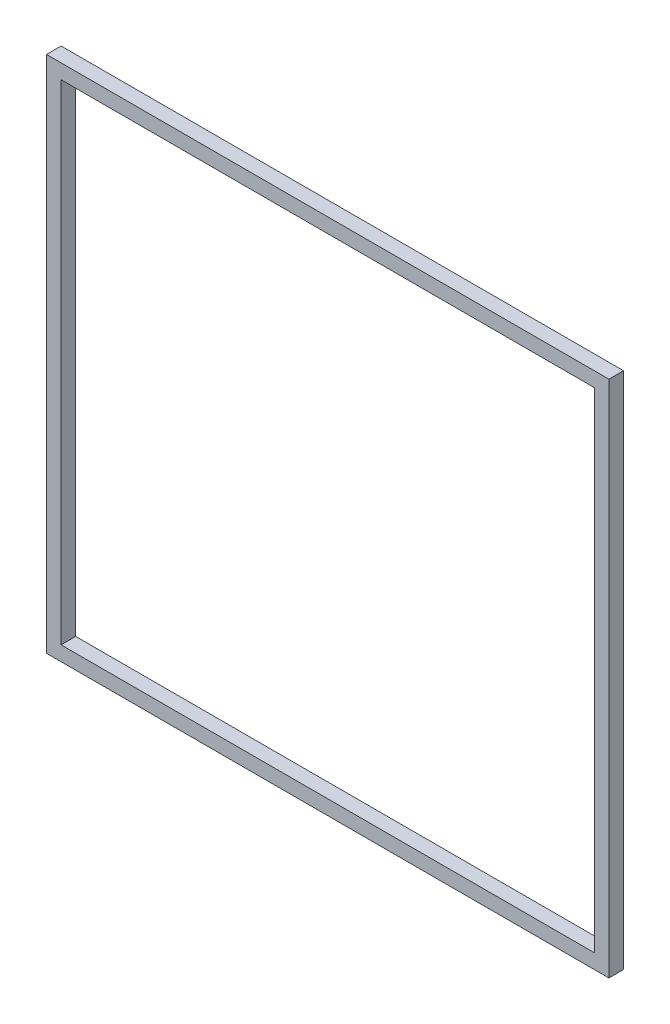
ISO-10303-21;
HEADER;
FILE_DESCRIPTION(('STEP AP214'),'2;1');
FILE_NAME('part.step','',(''),(''),'','','');
FILE_SCHEMA(('AUTOMOTIVE_DESIGN { 1 0 10303 214 1 1 1 1 }'));
ENDSEC;
DATA;
#1=APPLICATION_CONTEXT('core data for automotive mechanical design processes');
#2=APPLICATION_PROTOCOL_DEFINITION('international standard','automotive_design',2000,#1);
#3=PRODUCT_CONTEXT('',#1,'mechanical');
#4=PRODUCT('Part','Part','',(#3));
#5=PRODUCT_RELATED_PRODUCT_CATEGORY('part','',(#4));
#6=PRODUCT_DEFINITION_FORMATION('','',#4);
#7=PRODUCT_DEFINITION_CONTEXT('part definition',#1,'design');
#8=PRODUCT_DEFINITION('design','',#6,#7);
#9=PRODUCT_DEFINITION_SHAPE('','',#8);
#10=(LENGTH_UNIT() NAMED_UNIT(*) SI_UNIT(.MILLI.,.METRE.));
#11=(NAMED_UNIT(*) PLANE_ANGLE_UNIT() SI_UNIT($,.RADIAN.));
#12=(NAMED_UNIT(*) SI_UNIT($,.STERADIAN.) SOLID_ANGLE_UNIT());
#13=UNCERTAINTY_MEASURE_WITH_UNIT(LENGTH_MEASURE(1.E-05),#10,'distance_accuracy_value','');
#14=(GEOMETRIC_REPRESENTATION_CONTEXT(3) GLOBAL_UNCERTAINTY_ASSIGNED_CONTEXT((#13)) GLOBAL_UNIT_ASSIGNED_CONTEXT((#10,
#11,#12)) REPRESENTATION_CONTEXT('',''));
#15=CARTESIAN_POINT('',(0.,0.,0.));
#16=DIRECTION('',(0.,0.,1.));
#17=DIRECTION('',(1.,0.,0.));
#18=AXIS2_PLACEMENT_3D('',#15,#16,#17);
#19=CARTESIAN_POINT('',(0.,0.,20.));
#20=DIRECTION('',(0.,0.,1.));
#21=DIRECTION('',(1.,0.,0.));
#22=AXIS2_PLACEMENT_3D('',#19,#20,#21);
#23=PLANE('',#22);
#24=DIRECTION('',(0.,-1.,0.));
#25=VECTOR('',#24,1.);
#26=CARTESIAN_POINT('',(-385.,355.,20.));
#27=LINE('',#26,#25);
#28=CARTESIAN_POINT('',(-385.,355.,20.));
#29=VERTEX_POINT('',#28);
#30=CARTESIAN_POINT('',(-385.,-355.,20.));
#31=VERTEX_POINT('',#30);
#32=EDGE_CURVE('E133',#29,#31,#27,.T.);
#33=ORIENTED_EDGE('',*,*,#32,.T.);
#34=DIRECTION('',(1.,0.,0.));
#35=VECTOR('',#34,1.);
#36=CARTESIAN_POINT('',(-385.,-355.,20.));
#37=LINE('',#36,#35);
#38=CARTESIAN_POINT('',(385.,-355.,20.));
#39=VERTEX_POINT('',#38);
#40=EDGE_CURVE('E136',#31,#39,#37,.T.);
#41=ORIENTED_EDGE('',*,*,#40,.T.);
#42=DIRECTION('',(0.,1.,0.));
#43=VECTOR('',#42,1.);
#44=CARTESIAN_POINT('',(385.,355.,20.));
#45=LINE('',#44,#43);
#46=CARTESIAN_POINT('',(385.,355.,20.));
#47=VERTEX_POINT('',#46);
#48=EDGE_CURVE('E139',#39,#47,#45,.T.);
#49=ORIENTED_EDGE('',*,*,#48,.T.);
#50=DIRECTION('',(-1.,0.,0.));
#51=VECTOR('',#50,1.);
#52=CARTESIAN_POINT('',(-385.,355.,20.));
#53=LINE('',#52,#51);
#54=EDGE_CURVE('E141',#47,#29,#53,.T.);
#55=ORIENTED_EDGE('',*,*,#54,.T.);
#56=EDGE_LOOP('',(#33,#41,#49,#55));
#57=FACE_BOUND('',#56,.T.);
#58=DIRECTION('',(1.,0.,0.));
#59=VECTOR('',#58,1.);
#60=CARTESIAN_POINT('',(-365.,-335.,20.));
#61=LINE('',#60,#59);
#62=CARTESIAN_POINT('',(-365.,-335.,20.));
#63=VERTEX_POINT('',#62);
#64=CARTESIAN_POINT('',(365.,-335.,20.));
#65=VERTEX_POINT('',#64);
#66=EDGE_CURVE('E105',#63,#65,#61,.T.);
#67=ORIENTED_EDGE('',*,*,#66,.F.);
#68=DIRECTION('',(0.,-1.,0.));
#69=VECTOR('',#68,1.);
#70=CARTESIAN_POINT('',(-365.,335.,20.));
#71=LINE('',#70,#69);
#72=CARTESIAN_POINT('',(-365.,335.,20.));
#73=VERTEX_POINT('',#72);
#74=EDGE_CURVE('E97',#73,#63,#71,.T.);
#75=ORIENTED_EDGE('',*,*,#74,.F.);
#76=DIRECTION('',(-1.,0.,0.));
#77=VECTOR('',#76,1.);
#78=CARTESIAN_POINT('',(-365.,335.,20.));
#79=LINE('',#78,#77);
#80=CARTESIAN_POINT('',(365.,335.,20.));
#81=VERTEX_POINT('',#80);
#82=EDGE_CURVE('E119',#81,#73,#79,.T.);
#83=ORIENTED_EDGE('',*,*,#82,.F.);
#84=DIRECTION('',(0.,1.,0.));
#85=VECTOR('',#84,1.);
#86=CARTESIAN_POINT('',(365.,335.,20.));
#87=LINE('',#86,#85);
#88=EDGE_CURVE('E117',#65,#81,#87,.T.);
#89=ORIENTED_EDGE('',*,*,#88,.F.);
#90=EDGE_LOOP('',(#67,#75,#83,#89));
#91=FACE_BOUND('',#90,.T.);
#92=ADVANCED_FACE('F32',(#57,#91),#23,.T.);
#93=CARTESIAN_POINT('',(0.,0.,0.));
#94=DIRECTION('',(0.,0.,1.));
#95=DIRECTION('',(1.,0.,0.));
#96=AXIS2_PLACEMENT_3D('',#93,#94,#95);
#97=PLANE('',#96);
#98=DIRECTION('',(0.,-1.,0.));
#99=VECTOR('',#98,1.);
#100=CARTESIAN_POINT('',(-385.,355.,0.));
#101=LINE('',#100,#99);
#102=CARTESIAN_POINT('',(-385.,355.,0.));
#103=VERTEX_POINT('',#102);
#104=CARTESIAN_POINT('',(-385.,-355.,0.));
#105=VERTEX_POINT('',#104);
#106=EDGE_CURVE('E113',#103,#105,#101,.T.);
#107=ORIENTED_EDGE('',*,*,#106,.F.);
#108=DIRECTION('',(-1.,0.,0.));
#109=VECTOR('',#108,1.);
#110=CARTESIAN_POINT('',(-385.,355.,0.));
#111=LINE('',#110,#109);
#112=CARTESIAN_POINT('',(385.,355.,0.));
#113=VERTEX_POINT('',#112);
#114=EDGE_CURVE('E137',#113,#103,#111,.T.);
#115=ORIENTED_EDGE('',*,*,#114,.F.);
#116=DIRECTION('',(0.,1.,0.));
#117=VECTOR('',#116,1.);
#118=CARTESIAN_POINT('',(385.,355.,0.));
#119=LINE('',#118,#117);
#120=CARTESIAN_POINT('',(385.,-355.,0.));
#121=VERTEX_POINT('',#120);
#122=EDGE_CURVE('E148',#121,#113,#119,.T.);
#123=ORIENTED_EDGE('',*,*,#122,.F.);
#124=DIRECTION('',(1.,0.,0.));
#125=VECTOR('',#124,1.);
#126=CARTESIAN_POINT('',(-385.,-355.,0.));
#127=LINE('',#126,#125);
#128=EDGE_CURVE('E146',#105,#121,#127,.T.);
#129=ORIENTED_EDGE('',*,*,#128,.F.);
#130=EDGE_LOOP('',(#107,#115,#123,#129));
#131=FACE_BOUND('',#130,.T.);
#132=DIRECTION('',(0.,-1.,0.));
#133=VECTOR('',#132,1.);
#134=CARTESIAN_POINT('',(-365.,335.,0.));
#135=LINE('',#134,#133);
#136=CARTESIAN_POINT('',(-365.,335.,0.));
#137=VERTEX_POINT('',#136);
#138=CARTESIAN_POINT('',(-365.,-335.,0.));
#139=VERTEX_POINT('',#138);
#140=EDGE_CURVE('E55',#137,#139,#135,.T.);
#141=ORIENTED_EDGE('',*,*,#140,.T.);
#142=DIRECTION('',(1.,0.,0.));
#143=VECTOR('',#142,1.);
#144=CARTESIAN_POINT('',(-365.,-335.,0.));
#145=LINE('',#144,#143);
#146=CARTESIAN_POINT('',(365.,-335.,0.));
#147=VERTEX_POINT('',#146);
#148=EDGE_CURVE('E112',#139,#147,#145,.T.);
#149=ORIENTED_EDGE('',*,*,#148,.T.);
#150=DIRECTION('',(0.,1.,0.));
#151=VECTOR('',#150,1.);
#152=CARTESIAN_POINT('',(365.,335.,0.));
#153=LINE('',#152,#151);
#154=CARTESIAN_POINT('',(365.,335.,0.));
#155=VERTEX_POINT('',#154);
#156=EDGE_CURVE('E125',#147,#155,#153,.T.);
#157=ORIENTED_EDGE('',*,*,#156,.T.);
#158=DIRECTION('',(-1.,0.,0.));
#159=VECTOR('',#158,1.);
#160=CARTESIAN_POINT('',(-365.,335.,0.));
#161=LINE('',#160,#159);
#162=EDGE_CURVE('E106',#155,#137,#161,.T.);
#163=ORIENTED_EDGE('',*,*,#162,.T.);
#164=EDGE_LOOP('',(#141,#149,#157,#163));
#165=FACE_BOUND('',#164,.T.);
#166=ADVANCED_FACE('F166',(#131,#165),#97,.F.);
#167=CARTESIAN_POINT('',(-385.,355.,20.));
#168=DIRECTION('',(1.,0.,0.));
#169=DIRECTION('',(0.,1.,0.));
#170=AXIS2_PLACEMENT_3D('',#167,#168,#169);
#171=PLANE('',#170);
#172=ORIENTED_EDGE('',*,*,#106,.T.);
#173=DIRECTION('',(0.,0.,-1.));
#174=VECTOR('',#173,1.);
#175=CARTESIAN_POINT('',(-385.,-355.,20.));
#176=LINE('',#175,#174);
#177=EDGE_CURVE('E11',#31,#105,#176,.T.);
#178=ORIENTED_EDGE('',*,*,#177,.F.);
#179=ORIENTED_EDGE('',*,*,#32,.F.);
#180=DIRECTION('',(0.,0.,-1.));
#181=VECTOR('',#180,1.);
#182=CARTESIAN_POINT('',(-385.,355.,20.));
#183=LINE('',#182,#181);
#184=EDGE_CURVE('E143',#29,#103,#183,.T.);
#185=ORIENTED_EDGE('',*,*,#184,.T.);
#186=EDGE_LOOP('',(#172,#178,#179,#185));
#187=FACE_BOUND('',#186,.T.);
#188=ADVANCED_FACE('F34',(#187),#171,.F.);
#189=CARTESIAN_POINT('',(-385.,-355.,20.));
#190=DIRECTION('',(0.,1.,0.));
#191=DIRECTION('',(-1.,0.,0.));
#192=AXIS2_PLACEMENT_3D('',#189,#190,#191);
#193=PLANE('',#192);
#194=ORIENTED_EDGE('',*,*,#128,.T.);
#195=DIRECTION('',(0.,0.,-1.));
#196=VECTOR('',#195,1.);
#197=CARTESIAN_POINT('',(385.,-355.,20.));
#198=LINE('',#197,#196);
#199=EDGE_CURVE('E40',#39,#121,#198,.T.);
#200=ORIENTED_EDGE('',*,*,#199,.F.);
#201=ORIENTED_EDGE('',*,*,#40,.F.);
#202=ORIENTED_EDGE('',*,*,#177,.T.);
#203=EDGE_LOOP('',(#194,#200,#201,#202));
#204=FACE_BOUND('',#203,.T.);
#205=ADVANCED_FACE('F176',(#204),#193,.F.);
#206=CARTESIAN_POINT('',(385.,355.,20.));
#207=DIRECTION('',(-1.,0.,0.));
#208=DIRECTION('',(0.,-1.,0.));
#209=AXIS2_PLACEMENT_3D('',#206,#207,#208);
#210=PLANE('',#209);
#211=ORIENTED_EDGE('',*,*,#122,.T.);
#212=DIRECTION('',(0.,0.,-1.));
#213=VECTOR('',#212,1.);
#214=CARTESIAN_POINT('',(385.,355.,20.));
#215=LINE('',#214,#213);
#216=EDGE_CURVE('E153',#47,#113,#215,.T.);
#217=ORIENTED_EDGE('',*,*,#216,.F.);
#218=ORIENTED_EDGE('',*,*,#48,.F.);
#219=ORIENTED_EDGE('',*,*,#199,.T.);
#220=EDGE_LOOP('',(#211,#217,#218,#219));
#221=FACE_BOUND('',#220,.T.);
#222=ADVANCED_FACE('F160',(#221),#210,.F.);
#223=CARTESIAN_POINT('',(-385.,355.,20.));
#224=DIRECTION('',(0.,-1.,0.));
#225=DIRECTION('',(1.,0.,0.));
#226=AXIS2_PLACEMENT_3D('',#223,#224,#225);
#227=PLANE('',#226);
#228=ORIENTED_EDGE('',*,*,#114,.T.);
#229=ORIENTED_EDGE('',*,*,#184,.F.);
#230=ORIENTED_EDGE('',*,*,#54,.F.);
#231=ORIENTED_EDGE('',*,*,#216,.T.);
#232=EDGE_LOOP('',(#228,#229,#230,#231));
#233=FACE_BOUND('',#232,.T.);
#234=ADVANCED_FACE('F170',(#233),#227,.F.);
#235=CARTESIAN_POINT('',(-365.,335.,20.));
#236=DIRECTION('',(1.,0.,0.));
#237=DIRECTION('',(0.,1.,0.));
#238=AXIS2_PLACEMENT_3D('',#235,#236,#237);
#239=PLANE('',#238);
#240=ORIENTED_EDGE('',*,*,#140,.F.);
#241=DIRECTION('',(0.,0.,-1.));
#242=VECTOR('',#241,1.);
#243=CARTESIAN_POINT('',(-365.,335.,20.));
#244=LINE('',#243,#242);
#245=EDGE_CURVE('E101',#73,#137,#244,.T.);
#246=ORIENTED_EDGE('',*,*,#245,.F.);
#247=ORIENTED_EDGE('',*,*,#74,.T.);
#248=DIRECTION('',(0.,0.,-1.));
#249=VECTOR('',#248,1.);
#250=CARTESIAN_POINT('',(-365.,-335.,20.));
#251=LINE('',#250,#249);
#252=EDGE_CURVE('E100',#63,#139,#251,.T.);
#253=ORIENTED_EDGE('',*,*,#252,.T.);
#254=EDGE_LOOP('',(#240,#246,#247,#253));
#255=FACE_BOUND('',#254,.T.);
#256=ADVANCED_FACE('F99',(#255),#239,.T.);
#257=CARTESIAN_POINT('',(-365.,-335.,20.));
#258=DIRECTION('',(0.,1.,0.));
#259=DIRECTION('',(-1.,0.,0.));
#260=AXIS2_PLACEMENT_3D('',#257,#258,#259);
#261=PLANE('',#260);
#262=ORIENTED_EDGE('',*,*,#148,.F.);
#263=ORIENTED_EDGE('',*,*,#252,.F.);
#264=ORIENTED_EDGE('',*,*,#66,.T.);
#265=DIRECTION('',(0.,0.,-1.));
#266=VECTOR('',#265,1.);
#267=CARTESIAN_POINT('',(365.,-335.,20.));
#268=LINE('',#267,#266);
#269=EDGE_CURVE('E114',#65,#147,#268,.T.);
#270=ORIENTED_EDGE('',*,*,#269,.T.);
#271=EDGE_LOOP('',(#262,#263,#264,#270));
#272=FACE_BOUND('',#271,.T.);
#273=ADVANCED_FACE('F109',(#272),#261,.T.);
#274=CARTESIAN_POINT('',(365.,335.,20.));
#275=DIRECTION('',(-1.,0.,0.));
#276=DIRECTION('',(0.,-1.,0.));
#277=AXIS2_PLACEMENT_3D('',#274,#275,#276);
#278=PLANE('',#277);
#279=ORIENTED_EDGE('',*,*,#156,.F.);
#280=ORIENTED_EDGE('',*,*,#269,.F.);
#281=ORIENTED_EDGE('',*,*,#88,.T.);
#282=DIRECTION('',(0.,0.,-1.));
#283=VECTOR('',#282,1.);
#284=CARTESIAN_POINT('',(365.,335.,20.));
#285=LINE('',#284,#283);
#286=EDGE_CURVE('E47',#81,#155,#285,.T.);
#287=ORIENTED_EDGE('',*,*,#286,.T.);
#288=EDGE_LOOP('',(#279,#280,#281,#287));
#289=FACE_BOUND('',#288,.T.);
#290=ADVANCED_FACE('F199',(#289),#278,.T.);
#291=CARTESIAN_POINT('',(-365.,335.,20.));
#292=DIRECTION('',(0.,-1.,0.));
#293=DIRECTION('',(0.,0.,-1.));
#294=AXIS2_PLACEMENT_3D('',#291,#292,#293);
#295=PLANE('',#294);
#296=ORIENTED_EDGE('',*,*,#162,.F.);
#297=ORIENTED_EDGE('',*,*,#286,.F.);
#298=ORIENTED_EDGE('',*,*,#82,.T.);
#299=ORIENTED_EDGE('',*,*,#245,.T.);
#300=EDGE_LOOP('',(#296,#297,#298,#299));
#301=FACE_BOUND('',#300,.T.);
#302=ADVANCED_FACE('F203',(#301),#295,.T.);
#303=CLOSED_SHELL('',(#92,#166,#188,#205,#222,#234,#256,#273,#290,#302));
#304=MANIFOLD_SOLID_BREP('B2',#303);
#305=ADVANCED_BREP_SHAPE_REPRESENTATION('',(#18,#304),#14);
#306=SHAPE_DEFINITION_REPRESENTATION(#9,#305);
ENDSEC;
END-ISO-10303-21;
